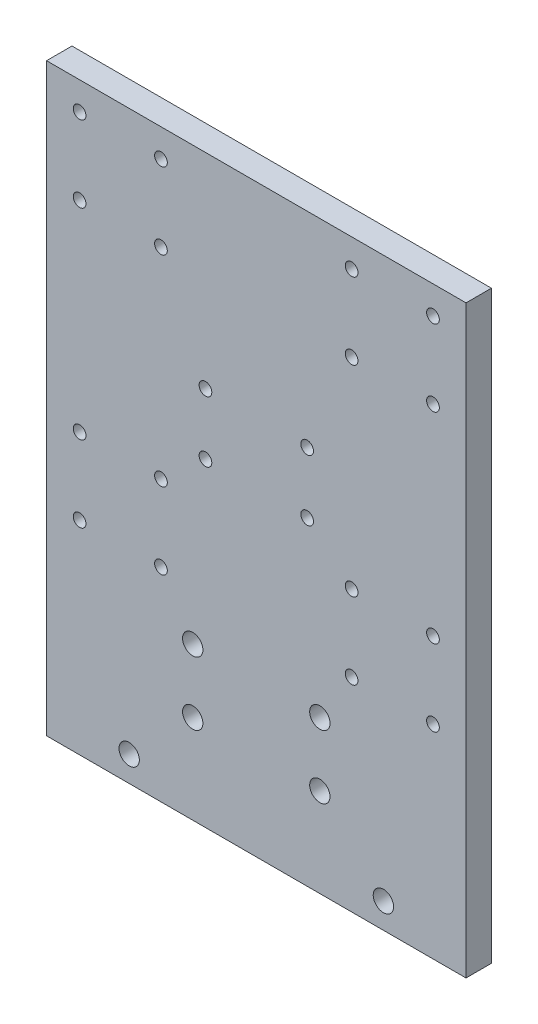
ISO-10303-21;
HEADER;
FILE_DESCRIPTION(('STEP AP214'),'2;1');
FILE_NAME('part.step','',(''),(''),'','','');
FILE_SCHEMA(('AUTOMOTIVE_DESIGN { 1 0 10303 214 1 1 1 1 }'));
ENDSEC;
DATA;
#1=APPLICATION_CONTEXT('core data for automotive mechanical design processes');
#2=APPLICATION_PROTOCOL_DEFINITION('international standard','automotive_design',2000,#1);
#3=PRODUCT_CONTEXT('',#1,'mechanical');
#4=PRODUCT('Part','Part','',(#3));
#5=PRODUCT_RELATED_PRODUCT_CATEGORY('part','',(#4));
#6=PRODUCT_DEFINITION_FORMATION('','',#4);
#7=PRODUCT_DEFINITION_CONTEXT('part definition',#1,'design');
#8=PRODUCT_DEFINITION('design','',#6,#7);
#9=PRODUCT_DEFINITION_SHAPE('','',#8);
#10=(LENGTH_UNIT() NAMED_UNIT(*) SI_UNIT(.MILLI.,.METRE.));
#11=(NAMED_UNIT(*) PLANE_ANGLE_UNIT() SI_UNIT($,.RADIAN.));
#12=(NAMED_UNIT(*) SI_UNIT($,.STERADIAN.) SOLID_ANGLE_UNIT());
#13=UNCERTAINTY_MEASURE_WITH_UNIT(LENGTH_MEASURE(1.E-05),#10,'distance_accuracy_value','');
#14=(GEOMETRIC_REPRESENTATION_CONTEXT(3) GLOBAL_UNCERTAINTY_ASSIGNED_CONTEXT((#13)) GLOBAL_UNIT_ASSIGNED_CONTEXT((#10,
#11,#12)) REPRESENTATION_CONTEXT('',''));
#15=CARTESIAN_POINT('',(0.,0.,0.));
#16=DIRECTION('',(0.,0.,1.));
#17=DIRECTION('',(1.,0.,0.));
#18=AXIS2_PLACEMENT_3D('',#15,#16,#17);
#19=CARTESIAN_POINT('',(82.5,115.,10.));
#20=DIRECTION('',(-1.,0.,0.));
#21=DIRECTION('',(0.,-1.,0.));
#22=AXIS2_PLACEMENT_3D('',#19,#20,#21);
#23=PLANE('',#22);
#24=DIRECTION('',(0.,1.,0.));
#25=VECTOR('',#24,1.);
#26=CARTESIAN_POINT('',(82.5,115.,0.));
#27=LINE('',#26,#25);
#28=CARTESIAN_POINT('',(82.5,-115.,0.));
#29=VERTEX_POINT('',#28);
#30=CARTESIAN_POINT('',(82.5,115.,0.));
#31=VERTEX_POINT('',#30);
#32=EDGE_CURVE('E95',#29,#31,#27,.T.);
#33=ORIENTED_EDGE('',*,*,#32,.T.);
#34=DIRECTION('',(0.,0.,-1.));
#35=VECTOR('',#34,1.);
#36=CARTESIAN_POINT('',(82.5,115.,10.));
#37=LINE('',#36,#35);
#38=CARTESIAN_POINT('',(82.5,115.,10.));
#39=VERTEX_POINT('',#38);
#40=EDGE_CURVE('E11',#39,#31,#37,.T.);
#41=ORIENTED_EDGE('',*,*,#40,.F.);
#42=DIRECTION('',(0.,1.,0.));
#43=VECTOR('',#42,1.);
#44=CARTESIAN_POINT('',(82.5,115.,10.));
#45=LINE('',#44,#43);
#46=CARTESIAN_POINT('',(82.5,-115.,10.));
#47=VERTEX_POINT('',#46);
#48=EDGE_CURVE('E83',#47,#39,#45,.T.);
#49=ORIENTED_EDGE('',*,*,#48,.F.);
#50=DIRECTION('',(0.,0.,-1.));
#51=VECTOR('',#50,1.);
#52=CARTESIAN_POINT('',(82.5,-115.,10.));
#53=LINE('',#52,#51);
#54=EDGE_CURVE('E91',#47,#29,#53,.T.);
#55=ORIENTED_EDGE('',*,*,#54,.T.);
#56=EDGE_LOOP('',(#33,#41,#49,#55));
#57=FACE_BOUND('',#56,.T.);
#58=ADVANCED_FACE('F32',(#57),#23,.F.);
#59=CARTESIAN_POINT('',(-82.5,115.,10.));
#60=DIRECTION('',(0.,-1.,0.));
#61=DIRECTION('',(0.,0.,-1.));
#62=AXIS2_PLACEMENT_3D('',#59,#60,#61);
#63=PLANE('',#62);
#64=DIRECTION('',(-1.,0.,0.));
#65=VECTOR('',#64,1.);
#66=CARTESIAN_POINT('',(-82.5,115.,0.));
#67=LINE('',#66,#65);
#68=CARTESIAN_POINT('',(-82.5,115.,0.));
#69=VERTEX_POINT('',#68);
#70=EDGE_CURVE('E87',#31,#69,#67,.T.);
#71=ORIENTED_EDGE('',*,*,#70,.T.);
#72=DIRECTION('',(0.,0.,-1.));
#73=VECTOR('',#72,1.);
#74=CARTESIAN_POINT('',(-82.5,115.,10.));
#75=LINE('',#74,#73);
#76=CARTESIAN_POINT('',(-82.5,115.,10.));
#77=VERTEX_POINT('',#76);
#78=EDGE_CURVE('E40',#77,#69,#75,.T.);
#79=ORIENTED_EDGE('',*,*,#78,.F.);
#80=DIRECTION('',(-1.,0.,0.));
#81=VECTOR('',#80,1.);
#82=CARTESIAN_POINT('',(-82.5,115.,10.));
#83=LINE('',#82,#81);
#84=EDGE_CURVE('E78',#39,#77,#83,.T.);
#85=ORIENTED_EDGE('',*,*,#84,.F.);
#86=ORIENTED_EDGE('',*,*,#40,.T.);
#87=EDGE_LOOP('',(#71,#79,#85,#86));
#88=FACE_BOUND('',#87,.T.);
#89=ADVANCED_FACE('F86',(#88),#63,.F.);
#90=CARTESIAN_POINT('',(-82.5,115.,10.));
#91=DIRECTION('',(1.,0.,0.));
#92=DIRECTION('',(0.,1.,0.));
#93=AXIS2_PLACEMENT_3D('',#90,#91,#92);
#94=PLANE('',#93);
#95=DIRECTION('',(0.,-1.,0.));
#96=VECTOR('',#95,1.);
#97=CARTESIAN_POINT('',(-82.5,115.,0.));
#98=LINE('',#97,#96);
#99=CARTESIAN_POINT('',(-82.5,-115.,0.));
#100=VERTEX_POINT('',#99);
#101=EDGE_CURVE('E65',#69,#100,#98,.T.);
#102=ORIENTED_EDGE('',*,*,#101,.T.);
#103=DIRECTION('',(0.,0.,-1.));
#104=VECTOR('',#103,1.);
#105=CARTESIAN_POINT('',(-82.5,-115.,10.));
#106=LINE('',#105,#104);
#107=CARTESIAN_POINT('',(-82.5,-115.,10.));
#108=VERTEX_POINT('',#107);
#109=EDGE_CURVE('E88',#108,#100,#106,.T.);
#110=ORIENTED_EDGE('',*,*,#109,.F.);
#111=DIRECTION('',(0.,-1.,0.));
#112=VECTOR('',#111,1.);
#113=CARTESIAN_POINT('',(-82.5,115.,10.));
#114=LINE('',#113,#112);
#115=EDGE_CURVE('E81',#77,#108,#114,.T.);
#116=ORIENTED_EDGE('',*,*,#115,.F.);
#117=ORIENTED_EDGE('',*,*,#78,.T.);
#118=EDGE_LOOP('',(#102,#110,#116,#117));
#119=FACE_BOUND('',#118,.T.);
#120=ADVANCED_FACE('F89',(#119),#94,.F.);
#121=CARTESIAN_POINT('',(-82.5,-115.,10.));
#122=DIRECTION('',(0.,1.,0.));
#123=DIRECTION('',(0.,0.,1.));
#124=AXIS2_PLACEMENT_3D('',#121,#122,#123);
#125=PLANE('',#124);
#126=DIRECTION('',(1.,0.,0.));
#127=VECTOR('',#126,1.);
#128=CARTESIAN_POINT('',(-82.5,-115.,0.));
#129=LINE('',#128,#127);
#130=EDGE_CURVE('E71',#100,#29,#129,.T.);
#131=ORIENTED_EDGE('',*,*,#130,.T.);
#132=ORIENTED_EDGE('',*,*,#54,.F.);
#133=DIRECTION('',(1.,0.,0.));
#134=VECTOR('',#133,1.);
#135=CARTESIAN_POINT('',(-82.5,-115.,10.));
#136=LINE('',#135,#134);
#137=EDGE_CURVE('E48',#108,#47,#136,.T.);
#138=ORIENTED_EDGE('',*,*,#137,.F.);
#139=ORIENTED_EDGE('',*,*,#109,.T.);
#140=EDGE_LOOP('',(#131,#132,#138,#139));
#141=FACE_BOUND('',#140,.T.);
#142=ADVANCED_FACE('F103',(#141),#125,.F.);
#143=CARTESIAN_POINT('',(0.,0.,10.));
#144=DIRECTION('',(0.,0.,1.));
#145=DIRECTION('',(1.,0.,0.));
#146=AXIS2_PLACEMENT_3D('',#143,#144,#145);
#147=PLANE('',#146);
#148=CARTESIAN_POINT('',(50.,-105.,10.));
#149=DIRECTION('',(0.,0.,1.));
#150=DIRECTION('',(1.,0.,0.));
#151=AXIS2_PLACEMENT_3D('',#148,#149,#150);
#152=CIRCLE('',#151,3.99999999999999);
#153=CARTESIAN_POINT('',(54.,-105.,10.));
#154=VERTEX_POINT('',#153);
#155=EDGE_CURVE('E261',#154,#154,#152,.T.);
#156=ORIENTED_EDGE('',*,*,#155,.F.);
#157=EDGE_LOOP('',(#156));
#158=FACE_BOUND('',#157,.T.);
#159=CARTESIAN_POINT('',(-50.,-105.,10.));
#160=DIRECTION('',(0.,0.,1.));
#161=DIRECTION('',(1.,0.,0.));
#162=AXIS2_PLACEMENT_3D('',#159,#160,#161);
#163=CIRCLE('',#162,3.99999999999999);
#164=CARTESIAN_POINT('',(-46.,-105.,10.));
#165=VERTEX_POINT('',#164);
#166=EDGE_CURVE('E255',#165,#165,#163,.T.);
#167=ORIENTED_EDGE('',*,*,#166,.F.);
#168=EDGE_LOOP('',(#167));
#169=FACE_BOUND('',#168,.T.);
#170=CARTESIAN_POINT('',(-25.0000000000001,-55.,10.));
#171=DIRECTION('',(0.,0.,1.));
#172=DIRECTION('',(1.,0.,0.));
#173=AXIS2_PLACEMENT_3D('',#170,#171,#172);
#174=CIRCLE('',#173,3.99999999999999);
#175=CARTESIAN_POINT('',(-21.0000000000001,-55.,10.));
#176=VERTEX_POINT('',#175);
#177=EDGE_CURVE('E249',#176,#176,#174,.T.);
#178=ORIENTED_EDGE('',*,*,#177,.F.);
#179=EDGE_LOOP('',(#178));
#180=FACE_BOUND('',#179,.T.);
#181=CARTESIAN_POINT('',(24.9999999999999,-55.,10.));
#182=DIRECTION('',(0.,0.,1.));
#183=DIRECTION('',(1.,0.,0.));
#184=AXIS2_PLACEMENT_3D('',#181,#182,#183);
#185=CIRCLE('',#184,3.99999999999999);
#186=CARTESIAN_POINT('',(28.9999999999999,-55.,10.));
#187=VERTEX_POINT('',#186);
#188=EDGE_CURVE('E243',#187,#187,#185,.T.);
#189=ORIENTED_EDGE('',*,*,#188,.F.);
#190=EDGE_LOOP('',(#189));
#191=FACE_BOUND('',#190,.T.);
#192=CARTESIAN_POINT('',(25.,-80.,10.));
#193=DIRECTION('',(0.,0.,1.));
#194=DIRECTION('',(1.,0.,0.));
#195=AXIS2_PLACEMENT_3D('',#192,#193,#194);
#196=CIRCLE('',#195,3.99999999999999);
#197=CARTESIAN_POINT('',(29.,-80.,10.));
#198=VERTEX_POINT('',#197);
#199=EDGE_CURVE('E237',#198,#198,#196,.T.);
#200=ORIENTED_EDGE('',*,*,#199,.F.);
#201=EDGE_LOOP('',(#200));
#202=FACE_BOUND('',#201,.T.);
#203=CARTESIAN_POINT('',(-25.,-80.,10.));
#204=DIRECTION('',(0.,0.,1.));
#205=DIRECTION('',(1.,0.,0.));
#206=AXIS2_PLACEMENT_3D('',#203,#204,#205);
#207=CIRCLE('',#206,3.99999999999999);
#208=CARTESIAN_POINT('',(-21.,-80.,10.));
#209=VERTEX_POINT('',#208);
#210=EDGE_CURVE('E231',#209,#209,#207,.T.);
#211=ORIENTED_EDGE('',*,*,#210,.F.);
#212=EDGE_LOOP('',(#211));
#213=FACE_BOUND('',#212,.T.);
#214=CARTESIAN_POINT('',(69.5,104.,10.));
#215=DIRECTION('',(0.,0.,-1.));
#216=DIRECTION('',(-1.,0.,0.));
#217=AXIS2_PLACEMENT_3D('',#214,#215,#216);
#218=CIRCLE('',#217,2.5);
#219=CARTESIAN_POINT('',(67.,104.,10.));
#220=VERTEX_POINT('',#219);
#221=EDGE_CURVE('E222',#220,#220,#218,.T.);
#222=ORIENTED_EDGE('',*,*,#221,.T.);
#223=EDGE_LOOP('',(#222));
#224=FACE_BOUND('',#223,.T.);
#225=CARTESIAN_POINT('',(37.5,104.,10.));
#226=DIRECTION('',(0.,0.,-1.));
#227=DIRECTION('',(-1.,0.,0.));
#228=AXIS2_PLACEMENT_3D('',#225,#226,#227);
#229=CIRCLE('',#228,2.5);
#230=CARTESIAN_POINT('',(35.,104.,10.));
#231=VERTEX_POINT('',#230);
#232=EDGE_CURVE('E216',#231,#231,#229,.T.);
#233=ORIENTED_EDGE('',*,*,#232,.T.);
#234=EDGE_LOOP('',(#233));
#235=FACE_BOUND('',#234,.T.);
#236=CARTESIAN_POINT('',(37.5,74.,10.));
#237=DIRECTION('',(0.,0.,-1.));
#238=DIRECTION('',(-1.,0.,0.));
#239=AXIS2_PLACEMENT_3D('',#236,#237,#238);
#240=CIRCLE('',#239,2.5);
#241=CARTESIAN_POINT('',(35.,74.,10.));
#242=VERTEX_POINT('',#241);
#243=EDGE_CURVE('E210',#242,#242,#240,.T.);
#244=ORIENTED_EDGE('',*,*,#243,.T.);
#245=EDGE_LOOP('',(#244));
#246=FACE_BOUND('',#245,.T.);
#247=CARTESIAN_POINT('',(69.5,74.,10.));
#248=DIRECTION('',(0.,0.,-1.));
#249=DIRECTION('',(-1.,0.,0.));
#250=AXIS2_PLACEMENT_3D('',#247,#248,#249);
#251=CIRCLE('',#250,2.5);
#252=CARTESIAN_POINT('',(67.,74.,10.));
#253=VERTEX_POINT('',#252);
#254=EDGE_CURVE('E204',#253,#253,#251,.T.);
#255=ORIENTED_EDGE('',*,*,#254,.T.);
#256=EDGE_LOOP('',(#255));
#257=FACE_BOUND('',#256,.T.);
#258=CARTESIAN_POINT('',(69.5,-5.,10.));
#259=DIRECTION('',(0.,0.,-1.));
#260=DIRECTION('',(-1.,0.,0.));
#261=AXIS2_PLACEMENT_3D('',#258,#259,#260);
#262=CIRCLE('',#261,2.5);
#263=CARTESIAN_POINT('',(67.,-5.,10.));
#264=VERTEX_POINT('',#263);
#265=EDGE_CURVE('E198',#264,#264,#262,.T.);
#266=ORIENTED_EDGE('',*,*,#265,.T.);
#267=EDGE_LOOP('',(#266));
#268=FACE_BOUND('',#267,.T.);
#269=CARTESIAN_POINT('',(37.5,-5.,10.));
#270=DIRECTION('',(0.,0.,-1.));
#271=DIRECTION('',(-1.,0.,0.));
#272=AXIS2_PLACEMENT_3D('',#269,#270,#271);
#273=CIRCLE('',#272,2.5);
#274=CARTESIAN_POINT('',(35.,-5.,10.));
#275=VERTEX_POINT('',#274);
#276=EDGE_CURVE('E192',#275,#275,#273,.T.);
#277=ORIENTED_EDGE('',*,*,#276,.T.);
#278=EDGE_LOOP('',(#277));
#279=FACE_BOUND('',#278,.T.);
#280=CARTESIAN_POINT('',(37.5,-35.,10.));
#281=DIRECTION('',(0.,0.,-1.));
#282=DIRECTION('',(-1.,0.,0.));
#283=AXIS2_PLACEMENT_3D('',#280,#281,#282);
#284=CIRCLE('',#283,2.5);
#285=CARTESIAN_POINT('',(35.,-35.,10.));
#286=VERTEX_POINT('',#285);
#287=EDGE_CURVE('E186',#286,#286,#284,.T.);
#288=ORIENTED_EDGE('',*,*,#287,.T.);
#289=EDGE_LOOP('',(#288));
#290=FACE_BOUND('',#289,.T.);
#291=CARTESIAN_POINT('',(69.5,-35.,10.));
#292=DIRECTION('',(0.,0.,-1.));
#293=DIRECTION('',(-1.,0.,0.));
#294=AXIS2_PLACEMENT_3D('',#291,#292,#293);
#295=CIRCLE('',#294,2.5);
#296=CARTESIAN_POINT('',(67.,-35.,10.));
#297=VERTEX_POINT('',#296);
#298=EDGE_CURVE('E180',#297,#297,#295,.T.);
#299=ORIENTED_EDGE('',*,*,#298,.T.);
#300=EDGE_LOOP('',(#299));
#301=FACE_BOUND('',#300,.T.);
#302=CARTESIAN_POINT('',(-37.5,104.,10.));
#303=DIRECTION('',(0.,0.,-1.));
#304=DIRECTION('',(-1.,0.,0.));
#305=AXIS2_PLACEMENT_3D('',#302,#303,#304);
#306=CIRCLE('',#305,2.5);
#307=CARTESIAN_POINT('',(-40.,104.,10.));
#308=VERTEX_POINT('',#307);
#309=EDGE_CURVE('E174',#308,#308,#306,.T.);
#310=ORIENTED_EDGE('',*,*,#309,.T.);
#311=EDGE_LOOP('',(#310));
#312=FACE_BOUND('',#311,.T.);
#313=CARTESIAN_POINT('',(-69.5,104.,10.));
#314=DIRECTION('',(0.,0.,-1.));
#315=DIRECTION('',(-1.,0.,0.));
#316=AXIS2_PLACEMENT_3D('',#313,#314,#315);
#317=CIRCLE('',#316,2.5);
#318=CARTESIAN_POINT('',(-72.,104.,10.));
#319=VERTEX_POINT('',#318);
#320=EDGE_CURVE('E168',#319,#319,#317,.T.);
#321=ORIENTED_EDGE('',*,*,#320,.T.);
#322=EDGE_LOOP('',(#321));
#323=FACE_BOUND('',#322,.T.);
#324=CARTESIAN_POINT('',(-69.5,74.,10.));
#325=DIRECTION('',(0.,0.,-1.));
#326=DIRECTION('',(-1.,0.,0.));
#327=AXIS2_PLACEMENT_3D('',#324,#325,#326);
#328=CIRCLE('',#327,2.5);
#329=CARTESIAN_POINT('',(-72.,74.,10.));
#330=VERTEX_POINT('',#329);
#331=EDGE_CURVE('E162',#330,#330,#328,.T.);
#332=ORIENTED_EDGE('',*,*,#331,.T.);
#333=EDGE_LOOP('',(#332));
#334=FACE_BOUND('',#333,.T.);
#335=CARTESIAN_POINT('',(-37.5,74.,10.));
#336=DIRECTION('',(0.,0.,-1.));
#337=DIRECTION('',(-1.,0.,0.));
#338=AXIS2_PLACEMENT_3D('',#335,#336,#337);
#339=CIRCLE('',#338,2.5);
#340=CARTESIAN_POINT('',(-40.,74.,10.));
#341=VERTEX_POINT('',#340);
#342=EDGE_CURVE('E156',#341,#341,#339,.T.);
#343=ORIENTED_EDGE('',*,*,#342,.T.);
#344=EDGE_LOOP('',(#343));
#345=FACE_BOUND('',#344,.T.);
#346=CARTESIAN_POINT('',(-37.5,-5.,10.));
#347=DIRECTION('',(0.,0.,-1.));
#348=DIRECTION('',(-1.,0.,0.));
#349=AXIS2_PLACEMENT_3D('',#346,#347,#348);
#350=CIRCLE('',#349,2.5);
#351=CARTESIAN_POINT('',(-40.,-5.,10.));
#352=VERTEX_POINT('',#351);
#353=EDGE_CURVE('E150',#352,#352,#350,.T.);
#354=ORIENTED_EDGE('',*,*,#353,.T.);
#355=EDGE_LOOP('',(#354));
#356=FACE_BOUND('',#355,.T.);
#357=CARTESIAN_POINT('',(-69.5,-5.,10.));
#358=DIRECTION('',(0.,0.,-1.));
#359=DIRECTION('',(-1.,0.,0.));
#360=AXIS2_PLACEMENT_3D('',#357,#358,#359);
#361=CIRCLE('',#360,2.5);
#362=CARTESIAN_POINT('',(-72.,-5.,10.));
#363=VERTEX_POINT('',#362);
#364=EDGE_CURVE('E144',#363,#363,#361,.T.);
#365=ORIENTED_EDGE('',*,*,#364,.T.);
#366=EDGE_LOOP('',(#365));
#367=FACE_BOUND('',#366,.T.);
#368=CARTESIAN_POINT('',(-69.5,-35.,10.));
#369=DIRECTION('',(0.,0.,-1.));
#370=DIRECTION('',(-1.,0.,0.));
#371=AXIS2_PLACEMENT_3D('',#368,#369,#370);
#372=CIRCLE('',#371,2.5);
#373=CARTESIAN_POINT('',(-72.,-35.,10.));
#374=VERTEX_POINT('',#373);
#375=EDGE_CURVE('E138',#374,#374,#372,.T.);
#376=ORIENTED_EDGE('',*,*,#375,.T.);
#377=EDGE_LOOP('',(#376));
#378=FACE_BOUND('',#377,.T.);
#379=CARTESIAN_POINT('',(-37.5,-35.,10.));
#380=DIRECTION('',(0.,0.,-1.));
#381=DIRECTION('',(-1.,0.,0.));
#382=AXIS2_PLACEMENT_3D('',#379,#380,#381);
#383=CIRCLE('',#382,2.5);
#384=CARTESIAN_POINT('',(-40.,-35.,10.));
#385=VERTEX_POINT('',#384);
#386=EDGE_CURVE('E132',#385,#385,#383,.T.);
#387=ORIENTED_EDGE('',*,*,#386,.T.);
#388=EDGE_LOOP('',(#387));
#389=FACE_BOUND('',#388,.T.);
#390=CARTESIAN_POINT('',(20.,34.5,10.));
#391=DIRECTION('',(0.,0.,-1.));
#392=DIRECTION('',(-1.,0.,0.));
#393=AXIS2_PLACEMENT_3D('',#390,#391,#392);
#394=CIRCLE('',#393,2.5);
#395=CARTESIAN_POINT('',(17.5,34.5,10.));
#396=VERTEX_POINT('',#395);
#397=EDGE_CURVE('E126',#396,#396,#394,.T.);
#398=ORIENTED_EDGE('',*,*,#397,.T.);
#399=EDGE_LOOP('',(#398));
#400=FACE_BOUND('',#399,.T.);
#401=CARTESIAN_POINT('',(-20.,34.5,10.));
#402=DIRECTION('',(0.,0.,-1.));
#403=DIRECTION('',(-1.,0.,0.));
#404=AXIS2_PLACEMENT_3D('',#401,#402,#403);
#405=CIRCLE('',#404,2.5);
#406=CARTESIAN_POINT('',(-22.5,34.5,10.));
#407=VERTEX_POINT('',#406);
#408=EDGE_CURVE('E120',#407,#407,#405,.T.);
#409=ORIENTED_EDGE('',*,*,#408,.T.);
#410=EDGE_LOOP('',(#409));
#411=FACE_BOUND('',#410,.T.);
#412=CARTESIAN_POINT('',(-20.,10.5,10.));
#413=DIRECTION('',(0.,0.,-1.));
#414=DIRECTION('',(-1.,0.,0.));
#415=AXIS2_PLACEMENT_3D('',#412,#413,#414);
#416=CIRCLE('',#415,2.5);
#417=CARTESIAN_POINT('',(-22.5,10.5,10.));
#418=VERTEX_POINT('',#417);
#419=EDGE_CURVE('E114',#418,#418,#416,.T.);
#420=ORIENTED_EDGE('',*,*,#419,.T.);
#421=EDGE_LOOP('',(#420));
#422=FACE_BOUND('',#421,.T.);
#423=CARTESIAN_POINT('',(20.,10.5,10.));
#424=DIRECTION('',(0.,0.,-1.));
#425=DIRECTION('',(-1.,0.,0.));
#426=AXIS2_PLACEMENT_3D('',#423,#424,#425);
#427=CIRCLE('',#426,2.5);
#428=CARTESIAN_POINT('',(17.5,10.5,10.));
#429=VERTEX_POINT('',#428);
#430=EDGE_CURVE('E98',#429,#429,#427,.T.);
#431=ORIENTED_EDGE('',*,*,#430,.T.);
#432=EDGE_LOOP('',(#431));
#433=FACE_BOUND('',#432,.T.);
#434=ORIENTED_EDGE('',*,*,#48,.T.);
#435=ORIENTED_EDGE('',*,*,#84,.T.);
#436=ORIENTED_EDGE('',*,*,#115,.T.);
#437=ORIENTED_EDGE('',*,*,#137,.T.);
#438=EDGE_LOOP('',(#434,#435,#436,#437));
#439=FACE_BOUND('',#438,.T.);
#440=ADVANCED_FACE('F79',(#158,#169,#180,#191,#202,#213,#224,#235,#246,#257,#268,#279,#290,#301,
#312,#323,#334,#345,#356,#367,#378,#389,#400,#411,#422,#433,#439),#147,.T.);
#441=CARTESIAN_POINT('',(0.,0.,0.));
#442=DIRECTION('',(0.,0.,1.));
#443=DIRECTION('',(1.,0.,0.));
#444=AXIS2_PLACEMENT_3D('',#441,#442,#443);
#445=PLANE('',#444);
#446=CARTESIAN_POINT('',(50.,-105.,0.));
#447=DIRECTION('',(0.,0.,1.));
#448=DIRECTION('',(1.,0.,0.));
#449=AXIS2_PLACEMENT_3D('',#446,#447,#448);
#450=CIRCLE('',#449,3.99999999999999);
#451=CARTESIAN_POINT('',(54.,-105.,0.));
#452=VERTEX_POINT('',#451);
#453=EDGE_CURVE('E258',#452,#452,#450,.T.);
#454=ORIENTED_EDGE('',*,*,#453,.T.);
#455=EDGE_LOOP('',(#454));
#456=FACE_BOUND('',#455,.T.);
#457=CARTESIAN_POINT('',(-50.,-105.,0.));
#458=DIRECTION('',(0.,0.,1.));
#459=DIRECTION('',(1.,0.,0.));
#460=AXIS2_PLACEMENT_3D('',#457,#458,#459);
#461=CIRCLE('',#460,3.99999999999999);
#462=CARTESIAN_POINT('',(-46.,-105.,0.));
#463=VERTEX_POINT('',#462);
#464=EDGE_CURVE('E252',#463,#463,#461,.T.);
#465=ORIENTED_EDGE('',*,*,#464,.T.);
#466=EDGE_LOOP('',(#465));
#467=FACE_BOUND('',#466,.T.);
#468=CARTESIAN_POINT('',(-25.0000000000001,-55.,0.));
#469=DIRECTION('',(0.,0.,1.));
#470=DIRECTION('',(1.,0.,0.));
#471=AXIS2_PLACEMENT_3D('',#468,#469,#470);
#472=CIRCLE('',#471,3.99999999999999);
#473=CARTESIAN_POINT('',(-21.0000000000001,-55.,0.));
#474=VERTEX_POINT('',#473);
#475=EDGE_CURVE('E246',#474,#474,#472,.T.);
#476=ORIENTED_EDGE('',*,*,#475,.T.);
#477=EDGE_LOOP('',(#476));
#478=FACE_BOUND('',#477,.T.);
#479=CARTESIAN_POINT('',(24.9999999999999,-55.,0.));
#480=DIRECTION('',(0.,0.,1.));
#481=DIRECTION('',(1.,0.,0.));
#482=AXIS2_PLACEMENT_3D('',#479,#480,#481);
#483=CIRCLE('',#482,3.99999999999999);
#484=CARTESIAN_POINT('',(28.9999999999999,-55.,0.));
#485=VERTEX_POINT('',#484);
#486=EDGE_CURVE('E240',#485,#485,#483,.T.);
#487=ORIENTED_EDGE('',*,*,#486,.T.);
#488=EDGE_LOOP('',(#487));
#489=FACE_BOUND('',#488,.T.);
#490=CARTESIAN_POINT('',(25.,-80.,0.));
#491=DIRECTION('',(0.,0.,1.));
#492=DIRECTION('',(1.,0.,0.));
#493=AXIS2_PLACEMENT_3D('',#490,#491,#492);
#494=CIRCLE('',#493,3.99999999999999);
#495=CARTESIAN_POINT('',(29.,-80.,0.));
#496=VERTEX_POINT('',#495);
#497=EDGE_CURVE('E234',#496,#496,#494,.T.);
#498=ORIENTED_EDGE('',*,*,#497,.T.);
#499=EDGE_LOOP('',(#498));
#500=FACE_BOUND('',#499,.T.);
#501=CARTESIAN_POINT('',(-25.,-80.,0.));
#502=DIRECTION('',(0.,0.,1.));
#503=DIRECTION('',(1.,0.,0.));
#504=AXIS2_PLACEMENT_3D('',#501,#502,#503);
#505=CIRCLE('',#504,3.99999999999999);
#506=CARTESIAN_POINT('',(-21.,-80.,0.));
#507=VERTEX_POINT('',#506);
#508=EDGE_CURVE('E228',#507,#507,#505,.T.);
#509=ORIENTED_EDGE('',*,*,#508,.T.);
#510=EDGE_LOOP('',(#509));
#511=FACE_BOUND('',#510,.T.);
#512=CARTESIAN_POINT('',(69.5,104.,0.));
#513=DIRECTION('',(0.,0.,-1.));
#514=DIRECTION('',(-1.,0.,0.));
#515=AXIS2_PLACEMENT_3D('',#512,#513,#514);
#516=CIRCLE('',#515,2.49999999999999);
#517=CARTESIAN_POINT('',(67.,104.,0.));
#518=VERTEX_POINT('',#517);
#519=EDGE_CURVE('E225',#518,#518,#516,.T.);
#520=ORIENTED_EDGE('',*,*,#519,.F.);
#521=EDGE_LOOP('',(#520));
#522=FACE_BOUND('',#521,.T.);
#523=CARTESIAN_POINT('',(37.5,104.,0.));
#524=DIRECTION('',(0.,0.,-1.));
#525=DIRECTION('',(-1.,0.,0.));
#526=AXIS2_PLACEMENT_3D('',#523,#524,#525);
#527=CIRCLE('',#526,2.49999999999999);
#528=CARTESIAN_POINT('',(35.,104.,0.));
#529=VERTEX_POINT('',#528);
#530=EDGE_CURVE('E219',#529,#529,#527,.T.);
#531=ORIENTED_EDGE('',*,*,#530,.F.);
#532=EDGE_LOOP('',(#531));
#533=FACE_BOUND('',#532,.T.);
#534=CARTESIAN_POINT('',(37.5,74.,0.));
#535=DIRECTION('',(0.,0.,-1.));
#536=DIRECTION('',(-1.,0.,0.));
#537=AXIS2_PLACEMENT_3D('',#534,#535,#536);
#538=CIRCLE('',#537,2.49999999999999);
#539=CARTESIAN_POINT('',(35.,74.,0.));
#540=VERTEX_POINT('',#539);
#541=EDGE_CURVE('E213',#540,#540,#538,.T.);
#542=ORIENTED_EDGE('',*,*,#541,.F.);
#543=EDGE_LOOP('',(#542));
#544=FACE_BOUND('',#543,.T.);
#545=CARTESIAN_POINT('',(69.5,74.,0.));
#546=DIRECTION('',(0.,0.,-1.));
#547=DIRECTION('',(-1.,0.,0.));
#548=AXIS2_PLACEMENT_3D('',#545,#546,#547);
#549=CIRCLE('',#548,2.49999999999999);
#550=CARTESIAN_POINT('',(67.,74.,0.));
#551=VERTEX_POINT('',#550);
#552=EDGE_CURVE('E207',#551,#551,#549,.T.);
#553=ORIENTED_EDGE('',*,*,#552,.F.);
#554=EDGE_LOOP('',(#553));
#555=FACE_BOUND('',#554,.T.);
#556=CARTESIAN_POINT('',(69.5,-5.,0.));
#557=DIRECTION('',(0.,0.,-1.));
#558=DIRECTION('',(-1.,0.,0.));
#559=AXIS2_PLACEMENT_3D('',#556,#557,#558);
#560=CIRCLE('',#559,2.49999999999999);
#561=CARTESIAN_POINT('',(67.,-5.,0.));
#562=VERTEX_POINT('',#561);
#563=EDGE_CURVE('E201',#562,#562,#560,.T.);
#564=ORIENTED_EDGE('',*,*,#563,.F.);
#565=EDGE_LOOP('',(#564));
#566=FACE_BOUND('',#565,.T.);
#567=CARTESIAN_POINT('',(37.5,-5.,0.));
#568=DIRECTION('',(0.,0.,-1.));
#569=DIRECTION('',(-1.,0.,0.));
#570=AXIS2_PLACEMENT_3D('',#567,#568,#569);
#571=CIRCLE('',#570,2.49999999999999);
#572=CARTESIAN_POINT('',(35.,-5.,0.));
#573=VERTEX_POINT('',#572);
#574=EDGE_CURVE('E195',#573,#573,#571,.T.);
#575=ORIENTED_EDGE('',*,*,#574,.F.);
#576=EDGE_LOOP('',(#575));
#577=FACE_BOUND('',#576,.T.);
#578=CARTESIAN_POINT('',(37.5,-35.,0.));
#579=DIRECTION('',(0.,0.,-1.));
#580=DIRECTION('',(-1.,0.,0.));
#581=AXIS2_PLACEMENT_3D('',#578,#579,#580);
#582=CIRCLE('',#581,2.49999999999999);
#583=CARTESIAN_POINT('',(35.,-35.,0.));
#584=VERTEX_POINT('',#583);
#585=EDGE_CURVE('E189',#584,#584,#582,.T.);
#586=ORIENTED_EDGE('',*,*,#585,.F.);
#587=EDGE_LOOP('',(#586));
#588=FACE_BOUND('',#587,.T.);
#589=CARTESIAN_POINT('',(69.5,-35.,0.));
#590=DIRECTION('',(0.,0.,-1.));
#591=DIRECTION('',(-1.,0.,0.));
#592=AXIS2_PLACEMENT_3D('',#589,#590,#591);
#593=CIRCLE('',#592,2.49999999999999);
#594=CARTESIAN_POINT('',(67.,-35.,0.));
#595=VERTEX_POINT('',#594);
#596=EDGE_CURVE('E183',#595,#595,#593,.T.);
#597=ORIENTED_EDGE('',*,*,#596,.F.);
#598=EDGE_LOOP('',(#597));
#599=FACE_BOUND('',#598,.T.);
#600=CARTESIAN_POINT('',(-37.5,104.,0.));
#601=DIRECTION('',(0.,0.,-1.));
#602=DIRECTION('',(-1.,0.,0.));
#603=AXIS2_PLACEMENT_3D('',#600,#601,#602);
#604=CIRCLE('',#603,2.49999999999999);
#605=CARTESIAN_POINT('',(-40.,104.,0.));
#606=VERTEX_POINT('',#605);
#607=EDGE_CURVE('E177',#606,#606,#604,.T.);
#608=ORIENTED_EDGE('',*,*,#607,.F.);
#609=EDGE_LOOP('',(#608));
#610=FACE_BOUND('',#609,.T.);
#611=CARTESIAN_POINT('',(-69.5,104.,0.));
#612=DIRECTION('',(0.,0.,-1.));
#613=DIRECTION('',(-1.,0.,0.));
#614=AXIS2_PLACEMENT_3D('',#611,#612,#613);
#615=CIRCLE('',#614,2.49999999999999);
#616=CARTESIAN_POINT('',(-72.,104.,0.));
#617=VERTEX_POINT('',#616);
#618=EDGE_CURVE('E171',#617,#617,#615,.T.);
#619=ORIENTED_EDGE('',*,*,#618,.F.);
#620=EDGE_LOOP('',(#619));
#621=FACE_BOUND('',#620,.T.);
#622=CARTESIAN_POINT('',(-69.5,74.,0.));
#623=DIRECTION('',(0.,0.,-1.));
#624=DIRECTION('',(-1.,0.,0.));
#625=AXIS2_PLACEMENT_3D('',#622,#623,#624);
#626=CIRCLE('',#625,2.49999999999999);
#627=CARTESIAN_POINT('',(-72.,74.,0.));
#628=VERTEX_POINT('',#627);
#629=EDGE_CURVE('E165',#628,#628,#626,.T.);
#630=ORIENTED_EDGE('',*,*,#629,.F.);
#631=EDGE_LOOP('',(#630));
#632=FACE_BOUND('',#631,.T.);
#633=CARTESIAN_POINT('',(-37.5,74.,0.));
#634=DIRECTION('',(0.,0.,-1.));
#635=DIRECTION('',(-1.,0.,0.));
#636=AXIS2_PLACEMENT_3D('',#633,#634,#635);
#637=CIRCLE('',#636,2.49999999999999);
#638=CARTESIAN_POINT('',(-40.,74.,0.));
#639=VERTEX_POINT('',#638);
#640=EDGE_CURVE('E159',#639,#639,#637,.T.);
#641=ORIENTED_EDGE('',*,*,#640,.F.);
#642=EDGE_LOOP('',(#641));
#643=FACE_BOUND('',#642,.T.);
#644=CARTESIAN_POINT('',(-37.5,-5.,0.));
#645=DIRECTION('',(0.,0.,-1.));
#646=DIRECTION('',(-1.,0.,0.));
#647=AXIS2_PLACEMENT_3D('',#644,#645,#646);
#648=CIRCLE('',#647,2.49999999999999);
#649=CARTESIAN_POINT('',(-40.,-5.,0.));
#650=VERTEX_POINT('',#649);
#651=EDGE_CURVE('E153',#650,#650,#648,.T.);
#652=ORIENTED_EDGE('',*,*,#651,.F.);
#653=EDGE_LOOP('',(#652));
#654=FACE_BOUND('',#653,.T.);
#655=CARTESIAN_POINT('',(-69.5,-5.,0.));
#656=DIRECTION('',(0.,0.,-1.));
#657=DIRECTION('',(-1.,0.,0.));
#658=AXIS2_PLACEMENT_3D('',#655,#656,#657);
#659=CIRCLE('',#658,2.49999999999999);
#660=CARTESIAN_POINT('',(-72.,-5.,0.));
#661=VERTEX_POINT('',#660);
#662=EDGE_CURVE('E147',#661,#661,#659,.T.);
#663=ORIENTED_EDGE('',*,*,#662,.F.);
#664=EDGE_LOOP('',(#663));
#665=FACE_BOUND('',#664,.T.);
#666=CARTESIAN_POINT('',(-69.5,-35.,0.));
#667=DIRECTION('',(0.,0.,-1.));
#668=DIRECTION('',(-1.,0.,0.));
#669=AXIS2_PLACEMENT_3D('',#666,#667,#668);
#670=CIRCLE('',#669,2.49999999999999);
#671=CARTESIAN_POINT('',(-72.,-35.,0.));
#672=VERTEX_POINT('',#671);
#673=EDGE_CURVE('E141',#672,#672,#670,.T.);
#674=ORIENTED_EDGE('',*,*,#673,.F.);
#675=EDGE_LOOP('',(#674));
#676=FACE_BOUND('',#675,.T.);
#677=CARTESIAN_POINT('',(-37.5,-35.,0.));
#678=DIRECTION('',(0.,0.,-1.));
#679=DIRECTION('',(-1.,0.,0.));
#680=AXIS2_PLACEMENT_3D('',#677,#678,#679);
#681=CIRCLE('',#680,2.49999999999999);
#682=CARTESIAN_POINT('',(-40.,-35.,0.));
#683=VERTEX_POINT('',#682);
#684=EDGE_CURVE('E135',#683,#683,#681,.T.);
#685=ORIENTED_EDGE('',*,*,#684,.F.);
#686=EDGE_LOOP('',(#685));
#687=FACE_BOUND('',#686,.T.);
#688=CARTESIAN_POINT('',(20.,34.5,0.));
#689=DIRECTION('',(0.,0.,-1.));
#690=DIRECTION('',(-1.,0.,0.));
#691=AXIS2_PLACEMENT_3D('',#688,#689,#690);
#692=CIRCLE('',#691,2.49999999999999);
#693=CARTESIAN_POINT('',(17.5,34.5,0.));
#694=VERTEX_POINT('',#693);
#695=EDGE_CURVE('E129',#694,#694,#692,.T.);
#696=ORIENTED_EDGE('',*,*,#695,.F.);
#697=EDGE_LOOP('',(#696));
#698=FACE_BOUND('',#697,.T.);
#699=CARTESIAN_POINT('',(-20.,34.5,0.));
#700=DIRECTION('',(0.,0.,-1.));
#701=DIRECTION('',(-1.,0.,0.));
#702=AXIS2_PLACEMENT_3D('',#699,#700,#701);
#703=CIRCLE('',#702,2.49999999999999);
#704=CARTESIAN_POINT('',(-22.5,34.5,0.));
#705=VERTEX_POINT('',#704);
#706=EDGE_CURVE('E123',#705,#705,#703,.T.);
#707=ORIENTED_EDGE('',*,*,#706,.F.);
#708=EDGE_LOOP('',(#707));
#709=FACE_BOUND('',#708,.T.);
#710=CARTESIAN_POINT('',(-20.,10.5,0.));
#711=DIRECTION('',(0.,0.,-1.));
#712=DIRECTION('',(-1.,0.,0.));
#713=AXIS2_PLACEMENT_3D('',#710,#711,#712);
#714=CIRCLE('',#713,2.49999999999999);
#715=CARTESIAN_POINT('',(-22.5,10.5,0.));
#716=VERTEX_POINT('',#715);
#717=EDGE_CURVE('E117',#716,#716,#714,.T.);
#718=ORIENTED_EDGE('',*,*,#717,.F.);
#719=EDGE_LOOP('',(#718));
#720=FACE_BOUND('',#719,.T.);
#721=CARTESIAN_POINT('',(20.,10.5,0.));
#722=DIRECTION('',(0.,0.,-1.));
#723=DIRECTION('',(-1.,0.,0.));
#724=AXIS2_PLACEMENT_3D('',#721,#722,#723);
#725=CIRCLE('',#724,2.49999999999999);
#726=CARTESIAN_POINT('',(17.5,10.5,0.));
#727=VERTEX_POINT('',#726);
#728=EDGE_CURVE('E111',#727,#727,#725,.T.);
#729=ORIENTED_EDGE('',*,*,#728,.F.);
#730=EDGE_LOOP('',(#729));
#731=FACE_BOUND('',#730,.T.);
#732=ORIENTED_EDGE('',*,*,#32,.F.);
#733=ORIENTED_EDGE('',*,*,#130,.F.);
#734=ORIENTED_EDGE('',*,*,#101,.F.);
#735=ORIENTED_EDGE('',*,*,#70,.F.);
#736=EDGE_LOOP('',(#732,#733,#734,#735));
#737=FACE_BOUND('',#736,.T.);
#738=ADVANCED_FACE('F106',(#456,#467,#478,#489,#500,#511,#522,#533,#544,#555,#566,#577,#588,
#599,#610,#621,#632,#643,#654,#665,#676,#687,#698,#709,#720,#731,#737),#445,.F.);
#739=CARTESIAN_POINT('',(20.,10.5,0.));
#740=DIRECTION('',(0.,0.,-1.));
#741=DIRECTION('',(-1.,0.,0.));
#742=AXIS2_PLACEMENT_3D('',#739,#740,#741);
#743=CYLINDRICAL_SURFACE('',#742,2.49999999999999);
#744=ORIENTED_EDGE('',*,*,#430,.F.);
#745=EDGE_LOOP('',(#744));
#746=FACE_BOUND('',#745,.T.);
#747=ORIENTED_EDGE('',*,*,#728,.T.);
#748=EDGE_LOOP('',(#747));
#749=FACE_BOUND('',#748,.T.);
#750=ADVANCED_FACE('F320',(#746,#749),#743,.F.);
#751=CARTESIAN_POINT('',(-20.,10.5,0.));
#752=DIRECTION('',(0.,0.,-1.));
#753=DIRECTION('',(-1.,0.,0.));
#754=AXIS2_PLACEMENT_3D('',#751,#752,#753);
#755=CYLINDRICAL_SURFACE('',#754,2.49999999999999);
#756=ORIENTED_EDGE('',*,*,#419,.F.);
#757=EDGE_LOOP('',(#756));
#758=FACE_BOUND('',#757,.T.);
#759=ORIENTED_EDGE('',*,*,#717,.T.);
#760=EDGE_LOOP('',(#759));
#761=FACE_BOUND('',#760,.T.);
#762=ADVANCED_FACE('F323',(#758,#761),#755,.F.);
#763=CARTESIAN_POINT('',(-20.,34.5,0.));
#764=DIRECTION('',(0.,0.,-1.));
#765=DIRECTION('',(-1.,0.,0.));
#766=AXIS2_PLACEMENT_3D('',#763,#764,#765);
#767=CYLINDRICAL_SURFACE('',#766,2.49999999999999);
#768=ORIENTED_EDGE('',*,*,#408,.F.);
#769=EDGE_LOOP('',(#768));
#770=FACE_BOUND('',#769,.T.);
#771=ORIENTED_EDGE('',*,*,#706,.T.);
#772=EDGE_LOOP('',(#771));
#773=FACE_BOUND('',#772,.T.);
#774=ADVANCED_FACE('F369',(#770,#773),#767,.F.);
#775=CARTESIAN_POINT('',(20.,34.5,0.));
#776=DIRECTION('',(0.,0.,-1.));
#777=DIRECTION('',(-1.,0.,0.));
#778=AXIS2_PLACEMENT_3D('',#775,#776,#777);
#779=CYLINDRICAL_SURFACE('',#778,2.49999999999999);
#780=ORIENTED_EDGE('',*,*,#397,.F.);
#781=EDGE_LOOP('',(#780));
#782=FACE_BOUND('',#781,.T.);
#783=ORIENTED_EDGE('',*,*,#695,.T.);
#784=EDGE_LOOP('',(#783));
#785=FACE_BOUND('',#784,.T.);
#786=ADVANCED_FACE('F377',(#782,#785),#779,.F.);
#787=CARTESIAN_POINT('',(-37.5,-35.,0.));
#788=DIRECTION('',(0.,0.,-1.));
#789=DIRECTION('',(-1.,0.,0.));
#790=AXIS2_PLACEMENT_3D('',#787,#788,#789);
#791=CYLINDRICAL_SURFACE('',#790,2.49999999999999);
#792=ORIENTED_EDGE('',*,*,#386,.F.);
#793=EDGE_LOOP('',(#792));
#794=FACE_BOUND('',#793,.T.);
#795=ORIENTED_EDGE('',*,*,#684,.T.);
#796=EDGE_LOOP('',(#795));
#797=FACE_BOUND('',#796,.T.);
#798=ADVANCED_FACE('F385',(#794,#797),#791,.F.);
#799=CARTESIAN_POINT('',(-69.5,-35.,0.));
#800=DIRECTION('',(0.,0.,-1.));
#801=DIRECTION('',(-1.,0.,0.));
#802=AXIS2_PLACEMENT_3D('',#799,#800,#801);
#803=CYLINDRICAL_SURFACE('',#802,2.5);
#804=ORIENTED_EDGE('',*,*,#375,.F.);
#805=EDGE_LOOP('',(#804));
#806=FACE_BOUND('',#805,.T.);
#807=ORIENTED_EDGE('',*,*,#673,.T.);
#808=EDGE_LOOP('',(#807));
#809=FACE_BOUND('',#808,.T.);
#810=ADVANCED_FACE('F393',(#806,#809),#803,.F.);
#811=CARTESIAN_POINT('',(-69.5,-5.,0.));
#812=DIRECTION('',(0.,0.,-1.));
#813=DIRECTION('',(-1.,0.,0.));
#814=AXIS2_PLACEMENT_3D('',#811,#812,#813);
#815=CYLINDRICAL_SURFACE('',#814,2.5);
#816=ORIENTED_EDGE('',*,*,#364,.F.);
#817=EDGE_LOOP('',(#816));
#818=FACE_BOUND('',#817,.T.);
#819=ORIENTED_EDGE('',*,*,#662,.T.);
#820=EDGE_LOOP('',(#819));
#821=FACE_BOUND('',#820,.T.);
#822=ADVANCED_FACE('F401',(#818,#821),#815,.F.);
#823=CARTESIAN_POINT('',(-37.5,-5.,0.));
#824=DIRECTION('',(0.,0.,-1.));
#825=DIRECTION('',(-1.,0.,0.));
#826=AXIS2_PLACEMENT_3D('',#823,#824,#825);
#827=CYLINDRICAL_SURFACE('',#826,2.49999999999999);
#828=ORIENTED_EDGE('',*,*,#353,.F.);
#829=EDGE_LOOP('',(#828));
#830=FACE_BOUND('',#829,.T.);
#831=ORIENTED_EDGE('',*,*,#651,.T.);
#832=EDGE_LOOP('',(#831));
#833=FACE_BOUND('',#832,.T.);
#834=ADVANCED_FACE('F409',(#830,#833),#827,.F.);
#835=CARTESIAN_POINT('',(-37.5,74.,0.));
#836=DIRECTION('',(0.,0.,-1.));
#837=DIRECTION('',(-1.,0.,0.));
#838=AXIS2_PLACEMENT_3D('',#835,#836,#837);
#839=CYLINDRICAL_SURFACE('',#838,2.49999999999999);
#840=ORIENTED_EDGE('',*,*,#342,.F.);
#841=EDGE_LOOP('',(#840));
#842=FACE_BOUND('',#841,.T.);
#843=ORIENTED_EDGE('',*,*,#640,.T.);
#844=EDGE_LOOP('',(#843));
#845=FACE_BOUND('',#844,.T.);
#846=ADVANCED_FACE('F417',(#842,#845),#839,.F.);
#847=CARTESIAN_POINT('',(-69.5,74.,0.));
#848=DIRECTION('',(0.,0.,-1.));
#849=DIRECTION('',(-1.,0.,0.));
#850=AXIS2_PLACEMENT_3D('',#847,#848,#849);
#851=CYLINDRICAL_SURFACE('',#850,2.5);
#852=ORIENTED_EDGE('',*,*,#331,.F.);
#853=EDGE_LOOP('',(#852));
#854=FACE_BOUND('',#853,.T.);
#855=ORIENTED_EDGE('',*,*,#629,.T.);
#856=EDGE_LOOP('',(#855));
#857=FACE_BOUND('',#856,.T.);
#858=ADVANCED_FACE('F425',(#854,#857),#851,.F.);
#859=CARTESIAN_POINT('',(-69.5,104.,0.));
#860=DIRECTION('',(0.,0.,-1.));
#861=DIRECTION('',(-1.,0.,0.));
#862=AXIS2_PLACEMENT_3D('',#859,#860,#861);
#863=CYLINDRICAL_SURFACE('',#862,2.5);
#864=ORIENTED_EDGE('',*,*,#320,.F.);
#865=EDGE_LOOP('',(#864));
#866=FACE_BOUND('',#865,.T.);
#867=ORIENTED_EDGE('',*,*,#618,.T.);
#868=EDGE_LOOP('',(#867));
#869=FACE_BOUND('',#868,.T.);
#870=ADVANCED_FACE('F433',(#866,#869),#863,.F.);
#871=CARTESIAN_POINT('',(-37.5,104.,0.));
#872=DIRECTION('',(0.,0.,-1.));
#873=DIRECTION('',(-1.,0.,0.));
#874=AXIS2_PLACEMENT_3D('',#871,#872,#873);
#875=CYLINDRICAL_SURFACE('',#874,2.49999999999999);
#876=ORIENTED_EDGE('',*,*,#309,.F.);
#877=EDGE_LOOP('',(#876));
#878=FACE_BOUND('',#877,.T.);
#879=ORIENTED_EDGE('',*,*,#607,.T.);
#880=EDGE_LOOP('',(#879));
#881=FACE_BOUND('',#880,.T.);
#882=ADVANCED_FACE('F441',(#878,#881),#875,.F.);
#883=CARTESIAN_POINT('',(69.5,-35.,0.));
#884=DIRECTION('',(0.,0.,-1.));
#885=DIRECTION('',(-1.,0.,0.));
#886=AXIS2_PLACEMENT_3D('',#883,#884,#885);
#887=CYLINDRICAL_SURFACE('',#886,2.5);
#888=ORIENTED_EDGE('',*,*,#298,.F.);
#889=EDGE_LOOP('',(#888));
#890=FACE_BOUND('',#889,.T.);
#891=ORIENTED_EDGE('',*,*,#596,.T.);
#892=EDGE_LOOP('',(#891));
#893=FACE_BOUND('',#892,.T.);
#894=ADVANCED_FACE('F449',(#890,#893),#887,.F.);
#895=CARTESIAN_POINT('',(37.5,-35.,0.));
#896=DIRECTION('',(0.,0.,-1.));
#897=DIRECTION('',(-1.,0.,0.));
#898=AXIS2_PLACEMENT_3D('',#895,#896,#897);
#899=CYLINDRICAL_SURFACE('',#898,2.49999999999999);
#900=ORIENTED_EDGE('',*,*,#287,.F.);
#901=EDGE_LOOP('',(#900));
#902=FACE_BOUND('',#901,.T.);
#903=ORIENTED_EDGE('',*,*,#585,.T.);
#904=EDGE_LOOP('',(#903));
#905=FACE_BOUND('',#904,.T.);
#906=ADVANCED_FACE('F457',(#902,#905),#899,.F.);
#907=CARTESIAN_POINT('',(37.5,-5.,0.));
#908=DIRECTION('',(0.,0.,-1.));
#909=DIRECTION('',(-1.,0.,0.));
#910=AXIS2_PLACEMENT_3D('',#907,#908,#909);
#911=CYLINDRICAL_SURFACE('',#910,2.49999999999999);
#912=ORIENTED_EDGE('',*,*,#276,.F.);
#913=EDGE_LOOP('',(#912));
#914=FACE_BOUND('',#913,.T.);
#915=ORIENTED_EDGE('',*,*,#574,.T.);
#916=EDGE_LOOP('',(#915));
#917=FACE_BOUND('',#916,.T.);
#918=ADVANCED_FACE('F465',(#914,#917),#911,.F.);
#919=CARTESIAN_POINT('',(69.5,-5.,0.));
#920=DIRECTION('',(0.,0.,-1.));
#921=DIRECTION('',(-1.,0.,0.));
#922=AXIS2_PLACEMENT_3D('',#919,#920,#921);
#923=CYLINDRICAL_SURFACE('',#922,2.5);
#924=ORIENTED_EDGE('',*,*,#265,.F.);
#925=EDGE_LOOP('',(#924));
#926=FACE_BOUND('',#925,.T.);
#927=ORIENTED_EDGE('',*,*,#563,.T.);
#928=EDGE_LOOP('',(#927));
#929=FACE_BOUND('',#928,.T.);
#930=ADVANCED_FACE('F473',(#926,#929),#923,.F.);
#931=CARTESIAN_POINT('',(69.5,74.,0.));
#932=DIRECTION('',(0.,0.,-1.));
#933=DIRECTION('',(-1.,0.,0.));
#934=AXIS2_PLACEMENT_3D('',#931,#932,#933);
#935=CYLINDRICAL_SURFACE('',#934,2.5);
#936=ORIENTED_EDGE('',*,*,#254,.F.);
#937=EDGE_LOOP('',(#936));
#938=FACE_BOUND('',#937,.T.);
#939=ORIENTED_EDGE('',*,*,#552,.T.);
#940=EDGE_LOOP('',(#939));
#941=FACE_BOUND('',#940,.T.);
#942=ADVANCED_FACE('F481',(#938,#941),#935,.F.);
#943=CARTESIAN_POINT('',(37.5,74.,0.));
#944=DIRECTION('',(0.,0.,-1.));
#945=DIRECTION('',(-1.,0.,0.));
#946=AXIS2_PLACEMENT_3D('',#943,#944,#945);
#947=CYLINDRICAL_SURFACE('',#946,2.49999999999999);
#948=ORIENTED_EDGE('',*,*,#243,.F.);
#949=EDGE_LOOP('',(#948));
#950=FACE_BOUND('',#949,.T.);
#951=ORIENTED_EDGE('',*,*,#541,.T.);
#952=EDGE_LOOP('',(#951));
#953=FACE_BOUND('',#952,.T.);
#954=ADVANCED_FACE('F489',(#950,#953),#947,.F.);
#955=CARTESIAN_POINT('',(37.5,104.,0.));
#956=DIRECTION('',(0.,0.,-1.));
#957=DIRECTION('',(-1.,0.,0.));
#958=AXIS2_PLACEMENT_3D('',#955,#956,#957);
#959=CYLINDRICAL_SURFACE('',#958,2.49999999999999);
#960=ORIENTED_EDGE('',*,*,#232,.F.);
#961=EDGE_LOOP('',(#960));
#962=FACE_BOUND('',#961,.T.);
#963=ORIENTED_EDGE('',*,*,#530,.T.);
#964=EDGE_LOOP('',(#963));
#965=FACE_BOUND('',#964,.T.);
#966=ADVANCED_FACE('F497',(#962,#965),#959,.F.);
#967=CARTESIAN_POINT('',(69.5,104.,0.));
#968=DIRECTION('',(0.,0.,-1.));
#969=DIRECTION('',(-1.,0.,0.));
#970=AXIS2_PLACEMENT_3D('',#967,#968,#969);
#971=CYLINDRICAL_SURFACE('',#970,2.5);
#972=ORIENTED_EDGE('',*,*,#221,.F.);
#973=EDGE_LOOP('',(#972));
#974=FACE_BOUND('',#973,.T.);
#975=ORIENTED_EDGE('',*,*,#519,.T.);
#976=EDGE_LOOP('',(#975));
#977=FACE_BOUND('',#976,.T.);
#978=ADVANCED_FACE('F505',(#974,#977),#971,.F.);
#979=CARTESIAN_POINT('',(-25.,-80.,10.));
#980=DIRECTION('',(0.,0.,1.));
#981=DIRECTION('',(1.,0.,0.));
#982=AXIS2_PLACEMENT_3D('',#979,#980,#981);
#983=CYLINDRICAL_SURFACE('',#982,3.99999999999999);
#984=ORIENTED_EDGE('',*,*,#508,.F.);
#985=EDGE_LOOP('',(#984));
#986=FACE_BOUND('',#985,.T.);
#987=ORIENTED_EDGE('',*,*,#210,.T.);
#988=EDGE_LOOP('',(#987));
#989=FACE_BOUND('',#988,.T.);
#990=ADVANCED_FACE('F513',(#986,#989),#983,.F.);
#991=CARTESIAN_POINT('',(25.,-80.,10.));
#992=DIRECTION('',(0.,0.,1.));
#993=DIRECTION('',(1.,0.,0.));
#994=AXIS2_PLACEMENT_3D('',#991,#992,#993);
#995=CYLINDRICAL_SURFACE('',#994,3.99999999999999);
#996=ORIENTED_EDGE('',*,*,#497,.F.);
#997=EDGE_LOOP('',(#996));
#998=FACE_BOUND('',#997,.T.);
#999=ORIENTED_EDGE('',*,*,#199,.T.);
#1000=EDGE_LOOP('',(#999));
#1001=FACE_BOUND('',#1000,.T.);
#1002=ADVANCED_FACE('F521',(#998,#1001),#995,.F.);
#1003=CARTESIAN_POINT('',(24.9999999999999,-55.,10.));
#1004=DIRECTION('',(0.,0.,1.));
#1005=DIRECTION('',(1.,0.,0.));
#1006=AXIS2_PLACEMENT_3D('',#1003,#1004,#1005);
#1007=CYLINDRICAL_SURFACE('',#1006,3.99999999999999);
#1008=ORIENTED_EDGE('',*,*,#486,.F.);
#1009=EDGE_LOOP('',(#1008));
#1010=FACE_BOUND('',#1009,.T.);
#1011=ORIENTED_EDGE('',*,*,#188,.T.);
#1012=EDGE_LOOP('',(#1011));
#1013=FACE_BOUND('',#1012,.T.);
#1014=ADVANCED_FACE('F529',(#1010,#1013),#1007,.F.);
#1015=CARTESIAN_POINT('',(-25.0000000000001,-55.,10.));
#1016=DIRECTION('',(0.,0.,1.));
#1017=DIRECTION('',(1.,0.,0.));
#1018=AXIS2_PLACEMENT_3D('',#1015,#1016,#1017);
#1019=CYLINDRICAL_SURFACE('',#1018,3.99999999999999);
#1020=ORIENTED_EDGE('',*,*,#475,.F.);
#1021=EDGE_LOOP('',(#1020));
#1022=FACE_BOUND('',#1021,.T.);
#1023=ORIENTED_EDGE('',*,*,#177,.T.);
#1024=EDGE_LOOP('',(#1023));
#1025=FACE_BOUND('',#1024,.T.);
#1026=ADVANCED_FACE('F537',(#1022,#1025),#1019,.F.);
#1027=CARTESIAN_POINT('',(-50.,-105.,10.));
#1028=DIRECTION('',(0.,0.,1.));
#1029=DIRECTION('',(1.,0.,0.));
#1030=AXIS2_PLACEMENT_3D('',#1027,#1028,#1029);
#1031=CYLINDRICAL_SURFACE('',#1030,3.99999999999999);
#1032=ORIENTED_EDGE('',*,*,#464,.F.);
#1033=EDGE_LOOP('',(#1032));
#1034=FACE_BOUND('',#1033,.T.);
#1035=ORIENTED_EDGE('',*,*,#166,.T.);
#1036=EDGE_LOOP('',(#1035));
#1037=FACE_BOUND('',#1036,.T.);
#1038=ADVANCED_FACE('F544',(#1034,#1037),#1031,.F.);
#1039=CARTESIAN_POINT('',(50.,-105.,10.));
#1040=DIRECTION('',(0.,0.,1.));
#1041=DIRECTION('',(1.,0.,0.));
#1042=AXIS2_PLACEMENT_3D('',#1039,#1040,#1041);
#1043=CYLINDRICAL_SURFACE('',#1042,3.99999999999999);
#1044=ORIENTED_EDGE('',*,*,#453,.F.);
#1045=EDGE_LOOP('',(#1044));
#1046=FACE_BOUND('',#1045,.T.);
#1047=ORIENTED_EDGE('',*,*,#155,.T.);
#1048=EDGE_LOOP('',(#1047));
#1049=FACE_BOUND('',#1048,.T.);
#1050=ADVANCED_FACE('F265',(#1046,#1049),#1043,.F.);
#1051=CLOSED_SHELL('',(#58,#89,#120,#142,#440,#738,#750,#762,#774,#786,#798,#810,#822,#834,#846,
#858,#870,#882,#894,#906,#918,#930,#942,#954,#966,#978,#990,#1002,#1014,#1026,#1038,#1050));
#1052=MANIFOLD_SOLID_BREP('B2',#1051);
#1053=ADVANCED_BREP_SHAPE_REPRESENTATION('',(#18,#1052),#14);
#1054=SHAPE_DEFINITION_REPRESENTATION(#9,#1053);
ENDSEC;
END-ISO-10303-21;
